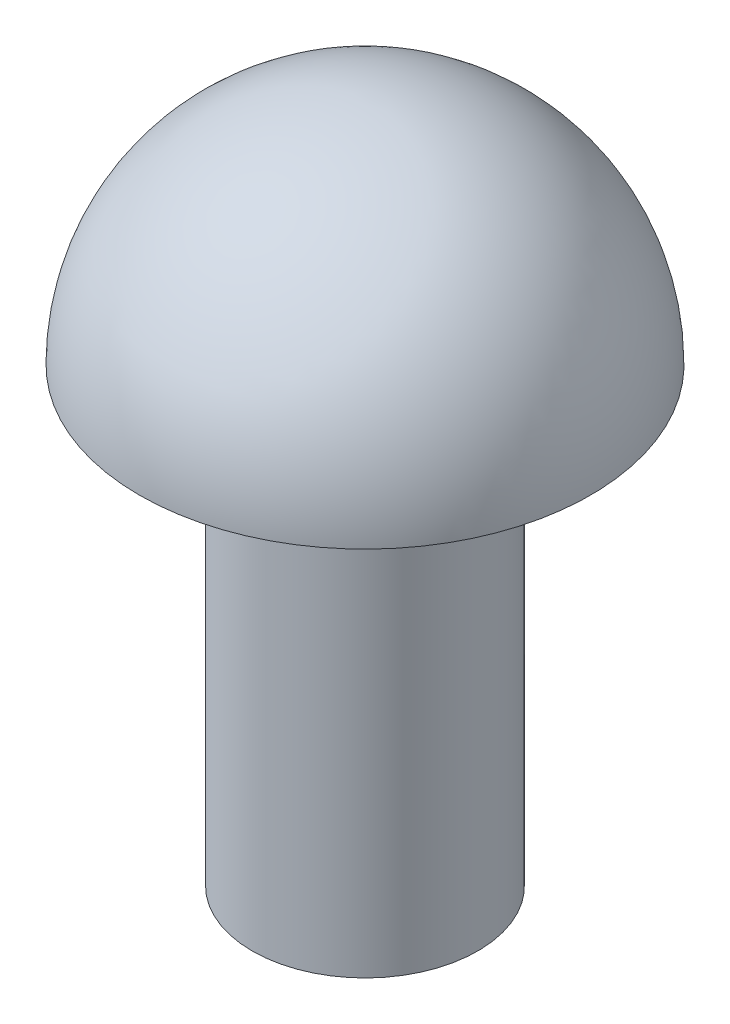
ISO-10303-21;
HEADER;
FILE_DESCRIPTION(('STEP AP214'),'2;1');
FILE_NAME('part.step','',(''),(''),'','','');
FILE_SCHEMA(('AUTOMOTIVE_DESIGN { 1 0 10303 214 1 1 1 1 }'));
ENDSEC;
DATA;
#1=APPLICATION_CONTEXT('core data for automotive mechanical design processes');
#2=APPLICATION_PROTOCOL_DEFINITION('international standard','automotive_design',2000,#1);
#3=PRODUCT_CONTEXT('',#1,'mechanical');
#4=PRODUCT('Part','Part','',(#3));
#5=PRODUCT_RELATED_PRODUCT_CATEGORY('part','',(#4));
#6=PRODUCT_DEFINITION_FORMATION('','',#4);
#7=PRODUCT_DEFINITION_CONTEXT('part definition',#1,'design');
#8=PRODUCT_DEFINITION('design','',#6,#7);
#9=PRODUCT_DEFINITION_SHAPE('','',#8);
#10=(LENGTH_UNIT() NAMED_UNIT(*) SI_UNIT(.MILLI.,.METRE.));
#11=(NAMED_UNIT(*) PLANE_ANGLE_UNIT() SI_UNIT($,.RADIAN.));
#12=(NAMED_UNIT(*) SI_UNIT($,.STERADIAN.) SOLID_ANGLE_UNIT());
#13=UNCERTAINTY_MEASURE_WITH_UNIT(LENGTH_MEASURE(1.E-05),#10,'distance_accuracy_value','');
#14=(GEOMETRIC_REPRESENTATION_CONTEXT(3) GLOBAL_UNCERTAINTY_ASSIGNED_CONTEXT((#13)) GLOBAL_UNIT_ASSIGNED_CONTEXT((#10,
#11,#12)) REPRESENTATION_CONTEXT('',''));
#15=CARTESIAN_POINT('',(0.,0.,0.));
#16=DIRECTION('',(0.,0.,1.));
#17=DIRECTION('',(1.,0.,0.));
#18=AXIS2_PLACEMENT_3D('',#15,#16,#17);
#19=CARTESIAN_POINT('',(0.,-10.,0.));
#20=DIRECTION('',(0.,1.,0.));
#21=DIRECTION('',(0.,0.,1.));
#22=AXIS2_PLACEMENT_3D('',#19,#20,#21);
#23=CYLINDRICAL_SURFACE('',#22,2.5);
#24=CARTESIAN_POINT('',(0.,-10.,0.));
#25=DIRECTION('',(0.,1.,0.));
#26=DIRECTION('',(0.,0.,1.));
#27=AXIS2_PLACEMENT_3D('',#24,#25,#26);
#28=CIRCLE('',#27,2.5);
#29=CARTESIAN_POINT('',(0.,-10.,2.5));
#30=VERTEX_POINT('',#29);
#31=EDGE_CURVE('E10',#30,#30,#28,.T.);
#32=ORIENTED_EDGE('',*,*,#31,.T.);
#33=EDGE_LOOP('',(#32));
#34=FACE_BOUND('',#33,.T.);
#35=CARTESIAN_POINT('',(0.,0.,0.));
#36=DIRECTION('',(0.,1.,0.));
#37=DIRECTION('',(0.,0.,1.));
#38=AXIS2_PLACEMENT_3D('',#35,#36,#37);
#39=CIRCLE('',#38,2.5);
#40=CARTESIAN_POINT('',(0.,0.,2.5));
#41=VERTEX_POINT('',#40);
#42=EDGE_CURVE('E47',#41,#41,#39,.T.);
#43=ORIENTED_EDGE('',*,*,#42,.F.);
#44=EDGE_LOOP('',(#43));
#45=FACE_BOUND('',#44,.T.);
#46=ADVANCED_FACE('F43',(#34,#45),#23,.T.);
#47=CARTESIAN_POINT('',(0.,-10.,0.));
#48=DIRECTION('',(0.,1.,0.));
#49=DIRECTION('',(0.,0.,1.));
#50=AXIS2_PLACEMENT_3D('',#47,#48,#49);
#51=PLANE('',#50);
#52=ORIENTED_EDGE('',*,*,#31,.F.);
#53=EDGE_LOOP('',(#52));
#54=FACE_BOUND('',#53,.T.);
#55=ADVANCED_FACE('F65',(#54),#51,.F.);
#56=CARTESIAN_POINT('',(0.,0.,0.));
#57=DIRECTION('',(0.,1.,0.));
#58=DIRECTION('',(0.,0.,1.));
#59=AXIS2_PLACEMENT_3D('',#56,#57,#58);
#60=PLANE('',#59);
#61=ORIENTED_EDGE('',*,*,#42,.T.);
#62=EDGE_LOOP('',(#61));
#63=FACE_BOUND('',#62,.T.);
#64=CARTESIAN_POINT('',(0.,0.,0.));
#65=DIRECTION('',(0.,1.,0.));
#66=DIRECTION('',(0.,0.,1.));
#67=AXIS2_PLACEMENT_3D('',#64,#65,#66);
#68=CIRCLE('',#67,5.);
#69=CARTESIAN_POINT('',(0.,0.,5.));
#70=VERTEX_POINT('',#69);
#71=EDGE_CURVE('E56',#70,#70,#68,.T.);
#72=ORIENTED_EDGE('',*,*,#71,.F.);
#73=EDGE_LOOP('',(#72));
#74=FACE_BOUND('',#73,.T.);
#75=ADVANCED_FACE('F63',(#63,#74),#60,.F.);
#76=CARTESIAN_POINT('',(0.,0.,0.));
#77=DIRECTION('',(0.,1.,0.));
#78=DIRECTION('',(0.,0.,1.));
#79=AXIS2_PLACEMENT_3D('',#76,#77,#78);
#80=SPHERICAL_SURFACE('',#79,5.);
#81=ORIENTED_EDGE('',*,*,#71,.T.);
#82=EDGE_LOOP('',(#81));
#83=FACE_BOUND('',#82,.T.);
#84=ADVANCED_FACE('F45',(#83),#80,.T.);
#85=CLOSED_SHELL('',(#46,#55,#75,#84));
#86=MANIFOLD_SOLID_BREP('B2',#85);
#87=ADVANCED_BREP_SHAPE_REPRESENTATION('',(#18,#86),#14);
#88=SHAPE_DEFINITION_REPRESENTATION(#9,#87);
ENDSEC;
END-ISO-10303-21;
